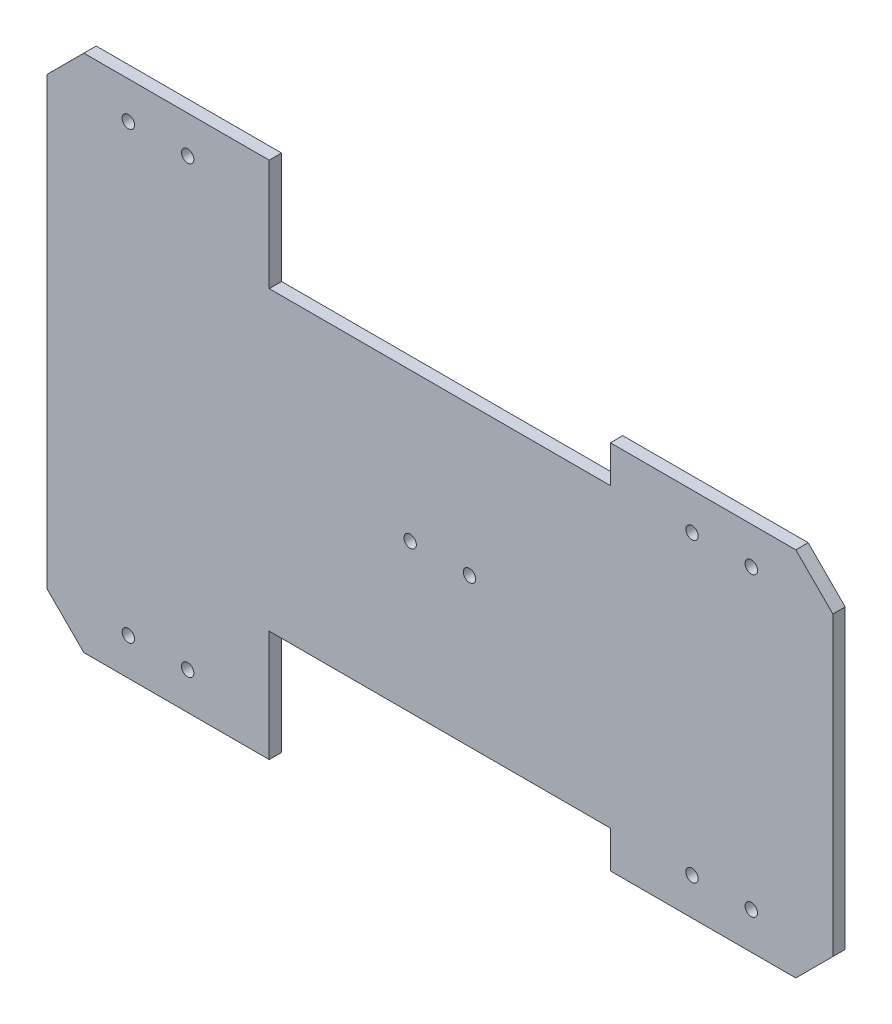
ISO-10303-21;
HEADER;
FILE_DESCRIPTION(('STEP AP214'),'2;1');
FILE_NAME('part.step','',(''),(''),'','','');
FILE_SCHEMA(('AUTOMOTIVE_DESIGN { 1 0 10303 214 1 1 1 1 }'));
ENDSEC;
DATA;
#1=APPLICATION_CONTEXT('core data for automotive mechanical design processes');
#2=APPLICATION_PROTOCOL_DEFINITION('international standard','automotive_design',2000,#1);
#3=PRODUCT_CONTEXT('',#1,'mechanical');
#4=PRODUCT('Part','Part','',(#3));
#5=PRODUCT_RELATED_PRODUCT_CATEGORY('part','',(#4));
#6=PRODUCT_DEFINITION_FORMATION('','',#4);
#7=PRODUCT_DEFINITION_CONTEXT('part definition',#1,'design');
#8=PRODUCT_DEFINITION('design','',#6,#7);
#9=PRODUCT_DEFINITION_SHAPE('','',#8);
#10=(LENGTH_UNIT() NAMED_UNIT(*) SI_UNIT(.MILLI.,.METRE.));
#11=(NAMED_UNIT(*) PLANE_ANGLE_UNIT() SI_UNIT($,.RADIAN.));
#12=(NAMED_UNIT(*) SI_UNIT($,.STERADIAN.) SOLID_ANGLE_UNIT());
#13=UNCERTAINTY_MEASURE_WITH_UNIT(LENGTH_MEASURE(1.E-05),#10,'distance_accuracy_value','');
#14=(GEOMETRIC_REPRESENTATION_CONTEXT(3) GLOBAL_UNCERTAINTY_ASSIGNED_CONTEXT((#13)) GLOBAL_UNIT_ASSIGNED_CONTEXT((#10,
#11,#12)) REPRESENTATION_CONTEXT('',''));
#15=CARTESIAN_POINT('',(0.,0.,0.));
#16=DIRECTION('',(0.,0.,1.));
#17=DIRECTION('',(1.,0.,0.));
#18=AXIS2_PLACEMENT_3D('',#15,#16,#17);
#19=CARTESIAN_POINT('',(-122.069969569105,-70.000000012,0.));
#20=DIRECTION('',(0.,-1.,0.));
#21=DIRECTION('',(0.,0.,-1.));
#22=AXIS2_PLACEMENT_3D('',#19,#20,#21);
#23=PLANE('',#22);
#24=DIRECTION('',(1.,0.,0.));
#25=VECTOR('',#24,1.);
#26=CARTESIAN_POINT('',(-122.069969569105,-70.000000012,5.));
#27=LINE('',#26,#25);
#28=CARTESIAN_POINT('',(-122.069969569105,-70.000000012,5.));
#29=VERTEX_POINT('',#28);
#30=CARTESIAN_POINT('',(15.9300304188953,-70.000000012,5.));
#31=VERTEX_POINT('',#30);
#32=EDGE_CURVE('E184',#29,#31,#27,.T.);
#33=ORIENTED_EDGE('',*,*,#32,.F.);
#34=DIRECTION('',(0.,0.,1.));
#35=VECTOR('',#34,1.);
#36=CARTESIAN_POINT('',(-122.069969569105,-70.000000012,0.));
#37=LINE('',#36,#35);
#38=CARTESIAN_POINT('',(-122.069969569105,-70.000000012,0.));
#39=VERTEX_POINT('',#38);
#40=EDGE_CURVE('E11',#39,#29,#37,.T.);
#41=ORIENTED_EDGE('',*,*,#40,.F.);
#42=DIRECTION('',(1.,0.,0.));
#43=VECTOR('',#42,1.);
#44=CARTESIAN_POINT('',(-122.069969569105,-70.000000012,0.));
#45=LINE('',#44,#43);
#46=CARTESIAN_POINT('',(15.9300304188953,-70.000000012,0.));
#47=VERTEX_POINT('',#46);
#48=EDGE_CURVE('E229',#39,#47,#45,.T.);
#49=ORIENTED_EDGE('',*,*,#48,.T.);
#50=DIRECTION('',(0.,0.,1.));
#51=VECTOR('',#50,1.);
#52=CARTESIAN_POINT('',(15.9300304188953,-70.000000012,0.));
#53=LINE('',#52,#51);
#54=EDGE_CURVE('E42',#47,#31,#53,.T.);
#55=ORIENTED_EDGE('',*,*,#54,.T.);
#56=EDGE_LOOP('',(#33,#41,#49,#55));
#57=FACE_BOUND('',#56,.T.);
#58=ADVANCED_FACE('F39',(#57),#23,.T.);
#59=CARTESIAN_POINT('',(-122.069969569105,-114.999999997,0.));
#60=DIRECTION('',(1.,0.,0.));
#61=DIRECTION('',(0.,0.,-1.));
#62=AXIS2_PLACEMENT_3D('',#59,#60,#61);
#63=PLANE('',#62);
#64=DIRECTION('',(0.,1.,0.));
#65=VECTOR('',#64,1.);
#66=CARTESIAN_POINT('',(-122.069969569105,-114.999999997,5.));
#67=LINE('',#66,#65);
#68=CARTESIAN_POINT('',(-122.069969569105,-114.999999997,5.));
#69=VERTEX_POINT('',#68);
#70=EDGE_CURVE('E227',#69,#29,#67,.T.);
#71=ORIENTED_EDGE('',*,*,#70,.F.);
#72=DIRECTION('',(0.,0.,1.));
#73=VECTOR('',#72,1.);
#74=CARTESIAN_POINT('',(-122.069969569105,-114.999999997,0.));
#75=LINE('',#74,#73);
#76=CARTESIAN_POINT('',(-122.069969569105,-114.999999997,0.));
#77=VERTEX_POINT('',#76);
#78=EDGE_CURVE('E48',#77,#69,#75,.T.);
#79=ORIENTED_EDGE('',*,*,#78,.F.);
#80=DIRECTION('',(0.,1.,0.));
#81=VECTOR('',#80,1.);
#82=CARTESIAN_POINT('',(-122.069969569105,-114.999999997,0.));
#83=LINE('',#82,#81);
#84=EDGE_CURVE('E174',#77,#39,#83,.T.);
#85=ORIENTED_EDGE('',*,*,#84,.T.);
#86=ORIENTED_EDGE('',*,*,#40,.T.);
#87=EDGE_LOOP('',(#71,#79,#85,#86));
#88=FACE_BOUND('',#87,.T.);
#89=ADVANCED_FACE('F257',(#88),#63,.T.);
#90=CARTESIAN_POINT('',(-197.069969626105,-114.999999997,0.));
#91=DIRECTION('',(0.,-1.,0.));
#92=DIRECTION('',(0.,0.,-1.));
#93=AXIS2_PLACEMENT_3D('',#90,#91,#92);
#94=PLANE('',#93);
#95=DIRECTION('',(1.,0.,0.));
#96=VECTOR('',#95,1.);
#97=CARTESIAN_POINT('',(-197.069969626105,-114.999999997,5.));
#98=LINE('',#97,#96);
#99=CARTESIAN_POINT('',(-197.069969626105,-114.999999997,5.));
#100=VERTEX_POINT('',#99);
#101=EDGE_CURVE('E161',#100,#69,#98,.T.);
#102=ORIENTED_EDGE('',*,*,#101,.F.);
#103=DIRECTION('',(0.,0.,1.));
#104=VECTOR('',#103,1.);
#105=CARTESIAN_POINT('',(-197.069969626105,-114.999999997,0.));
#106=LINE('',#105,#104);
#107=CARTESIAN_POINT('',(-197.069969626105,-114.999999997,0.));
#108=VERTEX_POINT('',#107);
#109=EDGE_CURVE('E156',#108,#100,#106,.T.);
#110=ORIENTED_EDGE('',*,*,#109,.F.);
#111=DIRECTION('',(1.,0.,0.));
#112=VECTOR('',#111,1.);
#113=CARTESIAN_POINT('',(-197.069969626105,-114.999999997,0.));
#114=LINE('',#113,#112);
#115=EDGE_CURVE('E159',#108,#77,#114,.T.);
#116=ORIENTED_EDGE('',*,*,#115,.T.);
#117=ORIENTED_EDGE('',*,*,#78,.T.);
#118=EDGE_LOOP('',(#102,#110,#116,#117));
#119=FACE_BOUND('',#118,.T.);
#120=ADVANCED_FACE('F158',(#119),#94,.T.);
#121=CARTESIAN_POINT('',(-212.069969578105,-100.000000045,0.));
#122=DIRECTION('',(-0.707106781186546,-0.707106781186549,0.));
#123=DIRECTION('',(0.707106781186549,-0.707106781186546,0.));
#124=AXIS2_PLACEMENT_3D('',#121,#122,#123);
#125=PLANE('',#124);
#126=DIRECTION('',(0.707106781186549,-0.707106781186546,0.));
#127=VECTOR('',#126,1.);
#128=CARTESIAN_POINT('',(-212.069969578105,-100.000000045,5.));
#129=LINE('',#128,#127);
#130=CARTESIAN_POINT('',(-212.069969578105,-100.000000045,5.));
#131=VERTEX_POINT('',#130);
#132=EDGE_CURVE('E224',#131,#100,#129,.T.);
#133=ORIENTED_EDGE('',*,*,#132,.F.);
#134=DIRECTION('',(0.,0.,1.));
#135=VECTOR('',#134,1.);
#136=CARTESIAN_POINT('',(-212.069969578105,-100.000000045,0.));
#137=LINE('',#136,#135);
#138=CARTESIAN_POINT('',(-212.069969578105,-100.000000045,0.));
#139=VERTEX_POINT('',#138);
#140=EDGE_CURVE('E166',#139,#131,#137,.T.);
#141=ORIENTED_EDGE('',*,*,#140,.F.);
#142=DIRECTION('',(0.707106781186549,-0.707106781186546,0.));
#143=VECTOR('',#142,1.);
#144=CARTESIAN_POINT('',(-212.069969578105,-100.000000045,0.));
#145=LINE('',#144,#143);
#146=EDGE_CURVE('E172',#139,#108,#145,.T.);
#147=ORIENTED_EDGE('',*,*,#146,.T.);
#148=ORIENTED_EDGE('',*,*,#109,.T.);
#149=EDGE_LOOP('',(#133,#141,#147,#148));
#150=FACE_BOUND('',#149,.T.);
#151=ADVANCED_FACE('F176',(#150),#125,.T.);
#152=CARTESIAN_POINT('',(-212.069969578105,80.000000045,0.));
#153=DIRECTION('',(-1.,0.,0.));
#154=DIRECTION('',(0.,-1.,0.));
#155=AXIS2_PLACEMENT_3D('',#152,#153,#154);
#156=PLANE('',#155);
#157=DIRECTION('',(0.,-1.,0.));
#158=VECTOR('',#157,1.);
#159=CARTESIAN_POINT('',(-212.069969578105,80.000000045,5.));
#160=LINE('',#159,#158);
#161=CARTESIAN_POINT('',(-212.069969578105,80.000000045,5.));
#162=VERTEX_POINT('',#161);
#163=EDGE_CURVE('E221',#162,#131,#160,.T.);
#164=ORIENTED_EDGE('',*,*,#163,.F.);
#165=DIRECTION('',(0.,0.,1.));
#166=VECTOR('',#165,1.);
#167=CARTESIAN_POINT('',(-212.069969578105,80.000000045,0.));
#168=LINE('',#167,#166);
#169=CARTESIAN_POINT('',(-212.069969578105,80.000000045,0.));
#170=VERTEX_POINT('',#169);
#171=EDGE_CURVE('E233',#170,#162,#168,.T.);
#172=ORIENTED_EDGE('',*,*,#171,.F.);
#173=DIRECTION('',(0.,-1.,0.));
#174=VECTOR('',#173,1.);
#175=CARTESIAN_POINT('',(-212.069969578105,80.000000045,0.));
#176=LINE('',#175,#174);
#177=EDGE_CURVE('E177',#170,#139,#176,.T.);
#178=ORIENTED_EDGE('',*,*,#177,.T.);
#179=ORIENTED_EDGE('',*,*,#140,.T.);
#180=EDGE_LOOP('',(#164,#172,#178,#179));
#181=FACE_BOUND('',#180,.T.);
#182=ADVANCED_FACE('F270',(#181),#156,.T.);
#183=CARTESIAN_POINT('',(-197.069969626105,94.9999999969999,0.));
#184=DIRECTION('',(-0.707106781186548,0.707106781186547,0.));
#185=DIRECTION('',(-0.707106781186547,-0.707106781186548,0.));
#186=AXIS2_PLACEMENT_3D('',#183,#184,#185);
#187=PLANE('',#186);
#188=DIRECTION('',(-0.707106781186547,-0.707106781186548,0.));
#189=VECTOR('',#188,1.);
#190=CARTESIAN_POINT('',(-197.069969626105,94.9999999969999,5.));
#191=LINE('',#190,#189);
#192=CARTESIAN_POINT('',(-197.069969626105,94.9999999969999,5.));
#193=VERTEX_POINT('',#192);
#194=EDGE_CURVE('E218',#193,#162,#191,.T.);
#195=ORIENTED_EDGE('',*,*,#194,.F.);
#196=DIRECTION('',(0.,0.,1.));
#197=VECTOR('',#196,1.);
#198=CARTESIAN_POINT('',(-197.069969626105,94.9999999969999,0.));
#199=LINE('',#198,#197);
#200=CARTESIAN_POINT('',(-197.069969626105,94.9999999969999,0.));
#201=VERTEX_POINT('',#200);
#202=EDGE_CURVE('E235',#201,#193,#199,.T.);
#203=ORIENTED_EDGE('',*,*,#202,.F.);
#204=DIRECTION('',(-0.707106781186547,-0.707106781186548,0.));
#205=VECTOR('',#204,1.);
#206=CARTESIAN_POINT('',(-197.069969626105,94.9999999969999,0.));
#207=LINE('',#206,#205);
#208=EDGE_CURVE('E179',#201,#170,#207,.T.);
#209=ORIENTED_EDGE('',*,*,#208,.T.);
#210=ORIENTED_EDGE('',*,*,#171,.T.);
#211=EDGE_LOOP('',(#195,#203,#209,#210));
#212=FACE_BOUND('',#211,.T.);
#213=ADVANCED_FACE('F273',(#212),#187,.T.);
#214=CARTESIAN_POINT('',(-122.069969569105,94.999999997,0.));
#215=DIRECTION('',(0.,1.,0.));
#216=DIRECTION('',(-1.,0.,0.));
#217=AXIS2_PLACEMENT_3D('',#214,#215,#216);
#218=PLANE('',#217);
#219=DIRECTION('',(-1.,0.,0.));
#220=VECTOR('',#219,1.);
#221=CARTESIAN_POINT('',(-122.069969569105,94.999999997,5.));
#222=LINE('',#221,#220);
#223=CARTESIAN_POINT('',(-122.069969569105,94.999999997,5.));
#224=VERTEX_POINT('',#223);
#225=EDGE_CURVE('E215',#224,#193,#222,.T.);
#226=ORIENTED_EDGE('',*,*,#225,.F.);
#227=DIRECTION('',(0.,0.,1.));
#228=VECTOR('',#227,1.);
#229=CARTESIAN_POINT('',(-122.069969569105,94.999999997,0.));
#230=LINE('',#229,#228);
#231=CARTESIAN_POINT('',(-122.069969569105,94.999999997,0.));
#232=VERTEX_POINT('',#231);
#233=EDGE_CURVE('E237',#232,#224,#230,.T.);
#234=ORIENTED_EDGE('',*,*,#233,.F.);
#235=DIRECTION('',(-1.,0.,0.));
#236=VECTOR('',#235,1.);
#237=CARTESIAN_POINT('',(-122.069969569105,94.999999997,0.));
#238=LINE('',#237,#236);
#239=EDGE_CURVE('E455',#232,#201,#238,.T.);
#240=ORIENTED_EDGE('',*,*,#239,.T.);
#241=ORIENTED_EDGE('',*,*,#202,.T.);
#242=EDGE_LOOP('',(#226,#234,#240,#241));
#243=FACE_BOUND('',#242,.T.);
#244=ADVANCED_FACE('F277',(#243),#218,.T.);
#245=CARTESIAN_POINT('',(-122.069969569105,50.000000018,0.));
#246=DIRECTION('',(1.,0.,0.));
#247=DIRECTION('',(0.,0.,-1.));
#248=AXIS2_PLACEMENT_3D('',#245,#246,#247);
#249=PLANE('',#248);
#250=DIRECTION('',(0.,1.,0.));
#251=VECTOR('',#250,1.);
#252=CARTESIAN_POINT('',(-122.069969569105,50.000000018,5.));
#253=LINE('',#252,#251);
#254=CARTESIAN_POINT('',(-122.069969569105,50.000000018,5.));
#255=VERTEX_POINT('',#254);
#256=EDGE_CURVE('E212',#255,#224,#253,.T.);
#257=ORIENTED_EDGE('',*,*,#256,.F.);
#258=DIRECTION('',(0.,0.,1.));
#259=VECTOR('',#258,1.);
#260=CARTESIAN_POINT('',(-122.069969569105,50.000000018,0.));
#261=LINE('',#260,#259);
#262=CARTESIAN_POINT('',(-122.069969569105,50.000000018,0.));
#263=VERTEX_POINT('',#262);
#264=EDGE_CURVE('E239',#263,#255,#261,.T.);
#265=ORIENTED_EDGE('',*,*,#264,.F.);
#266=DIRECTION('',(0.,1.,0.));
#267=VECTOR('',#266,1.);
#268=CARTESIAN_POINT('',(-122.069969569105,50.000000018,0.));
#269=LINE('',#268,#267);
#270=EDGE_CURVE('E452',#263,#232,#269,.T.);
#271=ORIENTED_EDGE('',*,*,#270,.T.);
#272=ORIENTED_EDGE('',*,*,#233,.T.);
#273=EDGE_LOOP('',(#257,#265,#271,#272));
#274=FACE_BOUND('',#273,.T.);
#275=ADVANCED_FACE('F281',(#274),#249,.T.);
#276=CARTESIAN_POINT('',(15.9300304188953,50.000000018,0.));
#277=DIRECTION('',(0.,1.,0.));
#278=DIRECTION('',(-1.,0.,0.));
#279=AXIS2_PLACEMENT_3D('',#276,#277,#278);
#280=PLANE('',#279);
#281=DIRECTION('',(-1.,0.,0.));
#282=VECTOR('',#281,1.);
#283=CARTESIAN_POINT('',(15.9300304188953,50.000000018,5.));
#284=LINE('',#283,#282);
#285=CARTESIAN_POINT('',(15.9300304188953,50.000000018,5.));
#286=VERTEX_POINT('',#285);
#287=EDGE_CURVE('E209',#286,#255,#284,.T.);
#288=ORIENTED_EDGE('',*,*,#287,.F.);
#289=DIRECTION('',(0.,0.,1.));
#290=VECTOR('',#289,1.);
#291=CARTESIAN_POINT('',(15.9300304188953,50.000000018,0.));
#292=LINE('',#291,#290);
#293=CARTESIAN_POINT('',(15.9300304188953,50.000000018,0.));
#294=VERTEX_POINT('',#293);
#295=EDGE_CURVE('E241',#294,#286,#292,.T.);
#296=ORIENTED_EDGE('',*,*,#295,.F.);
#297=DIRECTION('',(-1.,0.,0.));
#298=VECTOR('',#297,1.);
#299=CARTESIAN_POINT('',(15.9300304188953,50.000000018,0.));
#300=LINE('',#299,#298);
#301=EDGE_CURVE('E449',#294,#263,#300,.T.);
#302=ORIENTED_EDGE('',*,*,#301,.T.);
#303=ORIENTED_EDGE('',*,*,#264,.T.);
#304=EDGE_LOOP('',(#288,#296,#302,#303));
#305=FACE_BOUND('',#304,.T.);
#306=ADVANCED_FACE('F285',(#305),#280,.T.);
#307=CARTESIAN_POINT('',(15.9300304188953,64.999999967,0.));
#308=DIRECTION('',(-1.,0.,0.));
#309=DIRECTION('',(0.,0.,1.));
#310=AXIS2_PLACEMENT_3D('',#307,#308,#309);
#311=PLANE('',#310);
#312=DIRECTION('',(0.,-1.,0.));
#313=VECTOR('',#312,1.);
#314=CARTESIAN_POINT('',(15.9300304188953,64.999999967,5.));
#315=LINE('',#314,#313);
#316=CARTESIAN_POINT('',(15.9300304188953,64.999999967,5.));
#317=VERTEX_POINT('',#316);
#318=EDGE_CURVE('E206',#317,#286,#315,.T.);
#319=ORIENTED_EDGE('',*,*,#318,.F.);
#320=DIRECTION('',(0.,0.,1.));
#321=VECTOR('',#320,1.);
#322=CARTESIAN_POINT('',(15.9300304188953,64.999999967,0.));
#323=LINE('',#322,#321);
#324=CARTESIAN_POINT('',(15.9300304188953,64.999999967,0.));
#325=VERTEX_POINT('',#324);
#326=EDGE_CURVE('E243',#325,#317,#323,.T.);
#327=ORIENTED_EDGE('',*,*,#326,.F.);
#328=DIRECTION('',(0.,-1.,0.));
#329=VECTOR('',#328,1.);
#330=CARTESIAN_POINT('',(15.9300304188953,64.999999967,0.));
#331=LINE('',#330,#329);
#332=EDGE_CURVE('E446',#325,#294,#331,.T.);
#333=ORIENTED_EDGE('',*,*,#332,.T.);
#334=ORIENTED_EDGE('',*,*,#295,.T.);
#335=EDGE_LOOP('',(#319,#327,#333,#334));
#336=FACE_BOUND('',#335,.T.);
#337=ADVANCED_FACE('F289',(#336),#311,.T.);
#338=CARTESIAN_POINT('',(90.9300304758953,64.999999967,0.));
#339=DIRECTION('',(0.,1.,0.));
#340=DIRECTION('',(0.,0.,1.));
#341=AXIS2_PLACEMENT_3D('',#338,#339,#340);
#342=PLANE('',#341);
#343=DIRECTION('',(-1.,0.,0.));
#344=VECTOR('',#343,1.);
#345=CARTESIAN_POINT('',(90.9300304758953,64.999999967,5.));
#346=LINE('',#345,#344);
#347=CARTESIAN_POINT('',(90.9300304758953,64.999999967,5.));
#348=VERTEX_POINT('',#347);
#349=EDGE_CURVE('E203',#348,#317,#346,.T.);
#350=ORIENTED_EDGE('',*,*,#349,.F.);
#351=DIRECTION('',(0.,0.,1.));
#352=VECTOR('',#351,1.);
#353=CARTESIAN_POINT('',(90.9300304758953,64.999999967,0.));
#354=LINE('',#353,#352);
#355=CARTESIAN_POINT('',(90.9300304758953,64.999999967,0.));
#356=VERTEX_POINT('',#355);
#357=EDGE_CURVE('E245',#356,#348,#354,.T.);
#358=ORIENTED_EDGE('',*,*,#357,.F.);
#359=DIRECTION('',(-1.,0.,0.));
#360=VECTOR('',#359,1.);
#361=CARTESIAN_POINT('',(90.9300304758953,64.999999967,0.));
#362=LINE('',#361,#360);
#363=EDGE_CURVE('E443',#356,#325,#362,.T.);
#364=ORIENTED_EDGE('',*,*,#363,.T.);
#365=ORIENTED_EDGE('',*,*,#326,.T.);
#366=EDGE_LOOP('',(#350,#358,#364,#365));
#367=FACE_BOUND('',#366,.T.);
#368=ADVANCED_FACE('F293',(#367),#342,.T.);
#369=CARTESIAN_POINT('',(105.930030424145,50.00000001875,0.));
#370=DIRECTION('',(0.707106781186548,0.707106781186547,0.));
#371=DIRECTION('',(-0.707106781186547,0.707106781186548,0.));
#372=AXIS2_PLACEMENT_3D('',#369,#370,#371);
#373=PLANE('',#372);
#374=DIRECTION('',(-0.707106781186547,0.707106781186548,0.));
#375=VECTOR('',#374,1.);
#376=CARTESIAN_POINT('',(105.930030424145,50.00000001875,5.));
#377=LINE('',#376,#375);
#378=CARTESIAN_POINT('',(105.930030424145,50.00000001875,5.));
#379=VERTEX_POINT('',#378);
#380=EDGE_CURVE('E200',#379,#348,#377,.T.);
#381=ORIENTED_EDGE('',*,*,#380,.F.);
#382=DIRECTION('',(0.,0.,1.));
#383=VECTOR('',#382,1.);
#384=CARTESIAN_POINT('',(105.930030424145,50.00000001875,0.));
#385=LINE('',#384,#383);
#386=CARTESIAN_POINT('',(105.930030424145,50.00000001875,0.));
#387=VERTEX_POINT('',#386);
#388=EDGE_CURVE('E247',#387,#379,#385,.T.);
#389=ORIENTED_EDGE('',*,*,#388,.F.);
#390=DIRECTION('',(-0.707106781186547,0.707106781186548,0.));
#391=VECTOR('',#390,1.);
#392=CARTESIAN_POINT('',(105.930030424145,50.00000001875,0.));
#393=LINE('',#392,#391);
#394=EDGE_CURVE('E440',#387,#356,#393,.T.);
#395=ORIENTED_EDGE('',*,*,#394,.T.);
#396=ORIENTED_EDGE('',*,*,#357,.T.);
#397=EDGE_LOOP('',(#381,#389,#395,#396));
#398=FACE_BOUND('',#397,.T.);
#399=ADVANCED_FACE('F297',(#398),#373,.T.);
#400=CARTESIAN_POINT('',(105.930030424145,-70.00000004125,0.));
#401=DIRECTION('',(1.,0.,0.));
#402=DIRECTION('',(0.,1.,0.));
#403=AXIS2_PLACEMENT_3D('',#400,#401,#402);
#404=PLANE('',#403);
#405=DIRECTION('',(0.,1.,0.));
#406=VECTOR('',#405,1.);
#407=CARTESIAN_POINT('',(105.930030424145,-70.00000004125,5.));
#408=LINE('',#407,#406);
#409=CARTESIAN_POINT('',(105.930030424145,-70.00000004125,5.));
#410=VERTEX_POINT('',#409);
#411=EDGE_CURVE('E197',#410,#379,#408,.T.);
#412=ORIENTED_EDGE('',*,*,#411,.F.);
#413=DIRECTION('',(0.,0.,1.));
#414=VECTOR('',#413,1.);
#415=CARTESIAN_POINT('',(105.930030424145,-70.00000004125,0.));
#416=LINE('',#415,#414);
#417=CARTESIAN_POINT('',(105.930030424145,-70.00000004125,0.));
#418=VERTEX_POINT('',#417);
#419=EDGE_CURVE('E249',#418,#410,#416,.T.);
#420=ORIENTED_EDGE('',*,*,#419,.F.);
#421=DIRECTION('',(0.,1.,0.));
#422=VECTOR('',#421,1.);
#423=CARTESIAN_POINT('',(105.930030424145,-70.00000004125,0.));
#424=LINE('',#423,#422);
#425=EDGE_CURVE('E437',#418,#387,#424,.T.);
#426=ORIENTED_EDGE('',*,*,#425,.T.);
#427=ORIENTED_EDGE('',*,*,#388,.T.);
#428=EDGE_LOOP('',(#412,#420,#426,#427));
#429=FACE_BOUND('',#428,.T.);
#430=ADVANCED_FACE('F301',(#429),#404,.T.);
#431=CARTESIAN_POINT('',(90.9300304758953,-84.9999999895,0.));
#432=DIRECTION('',(0.707106781186548,-0.707106781186547,0.));
#433=DIRECTION('',(0.707106781186547,0.707106781186548,0.));
#434=AXIS2_PLACEMENT_3D('',#431,#432,#433);
#435=PLANE('',#434);
#436=DIRECTION('',(0.707106781186547,0.707106781186548,0.));
#437=VECTOR('',#436,1.);
#438=CARTESIAN_POINT('',(90.9300304758953,-84.9999999895,5.));
#439=LINE('',#438,#437);
#440=CARTESIAN_POINT('',(90.9300304758953,-84.9999999895,5.));
#441=VERTEX_POINT('',#440);
#442=EDGE_CURVE('E194',#441,#410,#439,.T.);
#443=ORIENTED_EDGE('',*,*,#442,.F.);
#444=DIRECTION('',(0.,0.,1.));
#445=VECTOR('',#444,1.);
#446=CARTESIAN_POINT('',(90.9300304758953,-84.9999999895,0.));
#447=LINE('',#446,#445);
#448=CARTESIAN_POINT('',(90.9300304758953,-84.9999999895,0.));
#449=VERTEX_POINT('',#448);
#450=EDGE_CURVE('E251',#449,#441,#447,.T.);
#451=ORIENTED_EDGE('',*,*,#450,.F.);
#452=DIRECTION('',(0.707106781186547,0.707106781186548,0.));
#453=VECTOR('',#452,1.);
#454=CARTESIAN_POINT('',(90.9300304758953,-84.9999999895,0.));
#455=LINE('',#454,#453);
#456=EDGE_CURVE('E434',#449,#418,#455,.T.);
#457=ORIENTED_EDGE('',*,*,#456,.T.);
#458=ORIENTED_EDGE('',*,*,#419,.T.);
#459=EDGE_LOOP('',(#443,#451,#457,#458));
#460=FACE_BOUND('',#459,.T.);
#461=ADVANCED_FACE('F305',(#460),#435,.T.);
#462=CARTESIAN_POINT('',(15.9300304188953,-84.9999999895,0.));
#463=DIRECTION('',(0.,-1.,0.));
#464=DIRECTION('',(0.,0.,-1.));
#465=AXIS2_PLACEMENT_3D('',#462,#463,#464);
#466=PLANE('',#465);
#467=DIRECTION('',(1.,0.,0.));
#468=VECTOR('',#467,1.);
#469=CARTESIAN_POINT('',(15.9300304188953,-84.9999999895,5.));
#470=LINE('',#469,#468);
#471=CARTESIAN_POINT('',(15.9300304188953,-84.9999999895,5.));
#472=VERTEX_POINT('',#471);
#473=EDGE_CURVE('E191',#472,#441,#470,.T.);
#474=ORIENTED_EDGE('',*,*,#473,.F.);
#475=DIRECTION('',(0.,0.,1.));
#476=VECTOR('',#475,1.);
#477=CARTESIAN_POINT('',(15.9300304188953,-84.9999999895,0.));
#478=LINE('',#477,#476);
#479=CARTESIAN_POINT('',(15.9300304188953,-84.9999999895,0.));
#480=VERTEX_POINT('',#479);
#481=EDGE_CURVE('E252',#480,#472,#478,.T.);
#482=ORIENTED_EDGE('',*,*,#481,.F.);
#483=DIRECTION('',(1.,0.,0.));
#484=VECTOR('',#483,1.);
#485=CARTESIAN_POINT('',(15.9300304188953,-84.9999999895,0.));
#486=LINE('',#485,#484);
#487=EDGE_CURVE('E431',#480,#449,#486,.T.);
#488=ORIENTED_EDGE('',*,*,#487,.T.);
#489=ORIENTED_EDGE('',*,*,#450,.T.);
#490=EDGE_LOOP('',(#474,#482,#488,#489));
#491=FACE_BOUND('',#490,.T.);
#492=ADVANCED_FACE('F309',(#491),#466,.T.);
#493=CARTESIAN_POINT('',(15.9300304188953,-70.000000012,0.));
#494=DIRECTION('',(-1.,0.,0.));
#495=DIRECTION('',(0.,0.,1.));
#496=AXIS2_PLACEMENT_3D('',#493,#494,#495);
#497=PLANE('',#496);
#498=DIRECTION('',(0.,-1.,0.));
#499=VECTOR('',#498,1.);
#500=CARTESIAN_POINT('',(15.9300304188953,-70.000000012,5.));
#501=LINE('',#500,#499);
#502=EDGE_CURVE('E187',#31,#472,#501,.T.);
#503=ORIENTED_EDGE('',*,*,#502,.F.);
#504=ORIENTED_EDGE('',*,*,#54,.F.);
#505=DIRECTION('',(0.,-1.,0.));
#506=VECTOR('',#505,1.);
#507=CARTESIAN_POINT('',(15.9300304188953,-70.000000012,0.));
#508=LINE('',#507,#506);
#509=EDGE_CURVE('E429',#47,#480,#508,.T.);
#510=ORIENTED_EDGE('',*,*,#509,.T.);
#511=ORIENTED_EDGE('',*,*,#481,.T.);
#512=EDGE_LOOP('',(#503,#504,#510,#511));
#513=FACE_BOUND('',#512,.T.);
#514=ADVANCED_FACE('F254',(#513),#497,.T.);
#515=CARTESIAN_POINT('',(0.,0.,0.));
#516=DIRECTION('',(0.,0.,-1.));
#517=DIRECTION('',(-1.,0.,0.));
#518=AXIS2_PLACEMENT_3D('',#515,#516,#517);
#519=PLANE('',#518);
#520=CARTESIAN_POINT('',(48.9300304215203,-70.0000000225,0.));
#521=DIRECTION('',(0.,0.,1.));
#522=DIRECTION('',(1.,0.,0.));
#523=AXIS2_PLACEMENT_3D('',#520,#521,#522);
#524=CIRCLE('',#523,2.5);
#525=CARTESIAN_POINT('',(51.4300304215203,-70.0000000225,0.));
#526=VERTEX_POINT('',#525);
#527=EDGE_CURVE('E368',#526,#526,#524,.T.);
#528=ORIENTED_EDGE('',*,*,#527,.T.);
#529=EDGE_LOOP('',(#528));
#530=FACE_BOUND('',#529,.T.);
#531=CARTESIAN_POINT('',(-155.069969573605,-100.,0.));
#532=DIRECTION('',(0.,0.,1.));
#533=DIRECTION('',(1.,0.,0.));
#534=AXIS2_PLACEMENT_3D('',#531,#532,#533);
#535=CIRCLE('',#534,2.50000000000002);
#536=CARTESIAN_POINT('',(-152.569969573605,-100.,0.));
#537=VERTEX_POINT('',#536);
#538=EDGE_CURVE('E376',#537,#537,#535,.T.);
#539=ORIENTED_EDGE('',*,*,#538,.T.);
#540=EDGE_LOOP('',(#539));
#541=FACE_BOUND('',#540,.T.);
#542=CARTESIAN_POINT('',(72.9300304215203,50.,0.));
#543=DIRECTION('',(0.,0.,1.));
#544=DIRECTION('',(1.,0.,0.));
#545=AXIS2_PLACEMENT_3D('',#542,#543,#544);
#546=CIRCLE('',#545,2.50000000000001);
#547=CARTESIAN_POINT('',(75.4300304215203,50.,0.));
#548=VERTEX_POINT('',#547);
#549=EDGE_CURVE('E382',#548,#548,#546,.T.);
#550=ORIENTED_EDGE('',*,*,#549,.T.);
#551=EDGE_LOOP('',(#550));
#552=FACE_BOUND('',#551,.T.);
#553=CARTESIAN_POINT('',(-179.069969573605,80.,0.));
#554=DIRECTION('',(0.,0.,1.));
#555=DIRECTION('',(1.,0.,0.));
#556=AXIS2_PLACEMENT_3D('',#553,#554,#555);
#557=CIRCLE('',#556,2.5);
#558=CARTESIAN_POINT('',(-176.569969573605,80.,0.));
#559=VERTEX_POINT('',#558);
#560=EDGE_CURVE('E388',#559,#559,#557,.T.);
#561=ORIENTED_EDGE('',*,*,#560,.T.);
#562=EDGE_LOOP('',(#561));
#563=FACE_BOUND('',#562,.T.);
#564=CARTESIAN_POINT('',(-41.0699695751047,-10.00000001125,0.));
#565=DIRECTION('',(0.,0.,1.));
#566=DIRECTION('',(-1.,0.,0.));
#567=AXIS2_PLACEMENT_3D('',#564,#565,#566);
#568=CIRCLE('',#567,2.5);
#569=CARTESIAN_POINT('',(-43.5699695751047,-10.00000001125,0.));
#570=VERTEX_POINT('',#569);
#571=EDGE_CURVE('E394',#570,#570,#568,.T.);
#572=ORIENTED_EDGE('',*,*,#571,.T.);
#573=EDGE_LOOP('',(#572));
#574=FACE_BOUND('',#573,.T.);
#575=CARTESIAN_POINT('',(-65.0699695751047,-10.,0.));
#576=DIRECTION('',(0.,0.,1.));
#577=DIRECTION('',(-1.,0.,0.));
#578=AXIS2_PLACEMENT_3D('',#575,#576,#577);
#579=CIRCLE('',#578,2.49999999999999);
#580=CARTESIAN_POINT('',(-67.5699695751047,-10.,0.));
#581=VERTEX_POINT('',#580);
#582=EDGE_CURVE('E400',#581,#581,#579,.T.);
#583=ORIENTED_EDGE('',*,*,#582,.T.);
#584=EDGE_LOOP('',(#583));
#585=FACE_BOUND('',#584,.T.);
#586=CARTESIAN_POINT('',(-179.069969573605,-99.9999999999999,0.));
#587=DIRECTION('',(0.,0.,1.));
#588=DIRECTION('',(-1.,0.,0.));
#589=AXIS2_PLACEMENT_3D('',#586,#587,#588);
#590=CIRCLE('',#589,2.49999999999997);
#591=CARTESIAN_POINT('',(-181.569969573605,-99.9999999999999,0.));
#592=VERTEX_POINT('',#591);
#593=EDGE_CURVE('E406',#592,#592,#590,.T.);
#594=ORIENTED_EDGE('',*,*,#593,.T.);
#595=EDGE_LOOP('',(#594));
#596=FACE_BOUND('',#595,.T.);
#597=CARTESIAN_POINT('',(-155.069969573605,80.,0.));
#598=DIRECTION('',(0.,0.,1.));
#599=DIRECTION('',(-1.,0.,0.));
#600=AXIS2_PLACEMENT_3D('',#597,#598,#599);
#601=CIRCLE('',#600,2.5);
#602=CARTESIAN_POINT('',(-157.569969573605,80.,0.));
#603=VERTEX_POINT('',#602);
#604=EDGE_CURVE('E412',#603,#603,#601,.T.);
#605=ORIENTED_EDGE('',*,*,#604,.T.);
#606=EDGE_LOOP('',(#605));
#607=FACE_BOUND('',#606,.T.);
#608=CARTESIAN_POINT('',(48.9300304215203,50.,0.));
#609=DIRECTION('',(0.,0.,1.));
#610=DIRECTION('',(-1.,0.,0.));
#611=AXIS2_PLACEMENT_3D('',#608,#609,#610);
#612=CIRCLE('',#611,2.5);
#613=CARTESIAN_POINT('',(46.4300304215203,50.,0.));
#614=VERTEX_POINT('',#613);
#615=EDGE_CURVE('E418',#614,#614,#612,.T.);
#616=ORIENTED_EDGE('',*,*,#615,.T.);
#617=EDGE_LOOP('',(#616));
#618=FACE_BOUND('',#617,.T.);
#619=CARTESIAN_POINT('',(72.9300304215203,-70.0000000224999,0.));
#620=DIRECTION('',(0.,0.,1.));
#621=DIRECTION('',(-1.,0.,0.));
#622=AXIS2_PLACEMENT_3D('',#619,#620,#621);
#623=CIRCLE('',#622,2.50000000000001);
#624=CARTESIAN_POINT('',(70.4300304215203,-70.0000000224999,0.));
#625=VERTEX_POINT('',#624);
#626=EDGE_CURVE('E188',#625,#625,#623,.T.);
#627=ORIENTED_EDGE('',*,*,#626,.T.);
#628=EDGE_LOOP('',(#627));
#629=FACE_BOUND('',#628,.T.);
#630=ORIENTED_EDGE('',*,*,#48,.F.);
#631=ORIENTED_EDGE('',*,*,#84,.F.);
#632=ORIENTED_EDGE('',*,*,#115,.F.);
#633=ORIENTED_EDGE('',*,*,#146,.F.);
#634=ORIENTED_EDGE('',*,*,#177,.F.);
#635=ORIENTED_EDGE('',*,*,#208,.F.);
#636=ORIENTED_EDGE('',*,*,#239,.F.);
#637=ORIENTED_EDGE('',*,*,#270,.F.);
#638=ORIENTED_EDGE('',*,*,#301,.F.);
#639=ORIENTED_EDGE('',*,*,#332,.F.);
#640=ORIENTED_EDGE('',*,*,#363,.F.);
#641=ORIENTED_EDGE('',*,*,#394,.F.);
#642=ORIENTED_EDGE('',*,*,#425,.F.);
#643=ORIENTED_EDGE('',*,*,#456,.F.);
#644=ORIENTED_EDGE('',*,*,#487,.F.);
#645=ORIENTED_EDGE('',*,*,#509,.F.);
#646=EDGE_LOOP('',(#630,#631,#632,#633,#634,#635,#636,#637,#638,#639,#640,#641,#642,#643,#644,#645));
#647=FACE_BOUND('',#646,.T.);
#648=ADVANCED_FACE('F170',(#530,#541,#552,#563,#574,#585,#596,#607,#618,#629,#647),#519,.T.);
#649=CARTESIAN_POINT('',(0.,0.,5.));
#650=DIRECTION('',(0.,0.,-1.));
#651=DIRECTION('',(-1.,0.,0.));
#652=AXIS2_PLACEMENT_3D('',#649,#650,#651);
#653=PLANE('',#652);
#654=CARTESIAN_POINT('',(48.9300304215203,-70.0000000225,5.));
#655=DIRECTION('',(0.,0.,1.));
#656=DIRECTION('',(1.,0.,0.));
#657=AXIS2_PLACEMENT_3D('',#654,#655,#656);
#658=CIRCLE('',#657,2.5);
#659=CARTESIAN_POINT('',(51.4300304215203,-70.0000000225,5.));
#660=VERTEX_POINT('',#659);
#661=EDGE_CURVE('E371',#660,#660,#658,.T.);
#662=ORIENTED_EDGE('',*,*,#661,.F.);
#663=EDGE_LOOP('',(#662));
#664=FACE_BOUND('',#663,.T.);
#665=CARTESIAN_POINT('',(-155.069969573605,-100.,5.));
#666=DIRECTION('',(0.,0.,1.));
#667=DIRECTION('',(1.,0.,0.));
#668=AXIS2_PLACEMENT_3D('',#665,#666,#667);
#669=CIRCLE('',#668,2.50000000000002);
#670=CARTESIAN_POINT('',(-152.569969573605,-100.,5.));
#671=VERTEX_POINT('',#670);
#672=EDGE_CURVE('E373',#671,#671,#669,.T.);
#673=ORIENTED_EDGE('',*,*,#672,.F.);
#674=EDGE_LOOP('',(#673));
#675=FACE_BOUND('',#674,.T.);
#676=CARTESIAN_POINT('',(72.9300304215203,50.,5.));
#677=DIRECTION('',(0.,0.,1.));
#678=DIRECTION('',(1.,0.,0.));
#679=AXIS2_PLACEMENT_3D('',#676,#677,#678);
#680=CIRCLE('',#679,2.50000000000001);
#681=CARTESIAN_POINT('',(75.4300304215203,50.,5.));
#682=VERTEX_POINT('',#681);
#683=EDGE_CURVE('E379',#682,#682,#680,.T.);
#684=ORIENTED_EDGE('',*,*,#683,.F.);
#685=EDGE_LOOP('',(#684));
#686=FACE_BOUND('',#685,.T.);
#687=CARTESIAN_POINT('',(-179.069969573605,80.,5.));
#688=DIRECTION('',(0.,0.,1.));
#689=DIRECTION('',(1.,0.,0.));
#690=AXIS2_PLACEMENT_3D('',#687,#688,#689);
#691=CIRCLE('',#690,2.5);
#692=CARTESIAN_POINT('',(-176.569969573605,80.,5.));
#693=VERTEX_POINT('',#692);
#694=EDGE_CURVE('E385',#693,#693,#691,.T.);
#695=ORIENTED_EDGE('',*,*,#694,.F.);
#696=EDGE_LOOP('',(#695));
#697=FACE_BOUND('',#696,.T.);
#698=CARTESIAN_POINT('',(-41.0699695751047,-10.00000001125,5.));
#699=DIRECTION('',(0.,0.,1.));
#700=DIRECTION('',(-1.,0.,0.));
#701=AXIS2_PLACEMENT_3D('',#698,#699,#700);
#702=CIRCLE('',#701,2.5);
#703=CARTESIAN_POINT('',(-43.5699695751047,-10.00000001125,5.));
#704=VERTEX_POINT('',#703);
#705=EDGE_CURVE('E391',#704,#704,#702,.T.);
#706=ORIENTED_EDGE('',*,*,#705,.F.);
#707=EDGE_LOOP('',(#706));
#708=FACE_BOUND('',#707,.T.);
#709=CARTESIAN_POINT('',(-65.0699695751047,-10.,5.));
#710=DIRECTION('',(0.,0.,1.));
#711=DIRECTION('',(-1.,0.,0.));
#712=AXIS2_PLACEMENT_3D('',#709,#710,#711);
#713=CIRCLE('',#712,2.49999999999999);
#714=CARTESIAN_POINT('',(-67.5699695751047,-10.,5.));
#715=VERTEX_POINT('',#714);
#716=EDGE_CURVE('E397',#715,#715,#713,.T.);
#717=ORIENTED_EDGE('',*,*,#716,.F.);
#718=EDGE_LOOP('',(#717));
#719=FACE_BOUND('',#718,.T.);
#720=CARTESIAN_POINT('',(-179.069969573605,-99.9999999999999,5.));
#721=DIRECTION('',(0.,0.,1.));
#722=DIRECTION('',(-1.,0.,0.));
#723=AXIS2_PLACEMENT_3D('',#720,#721,#722);
#724=CIRCLE('',#723,2.49999999999997);
#725=CARTESIAN_POINT('',(-181.569969573605,-99.9999999999999,5.));
#726=VERTEX_POINT('',#725);
#727=EDGE_CURVE('E403',#726,#726,#724,.T.);
#728=ORIENTED_EDGE('',*,*,#727,.F.);
#729=EDGE_LOOP('',(#728));
#730=FACE_BOUND('',#729,.T.);
#731=CARTESIAN_POINT('',(-155.069969573605,80.,5.));
#732=DIRECTION('',(0.,0.,1.));
#733=DIRECTION('',(-1.,0.,0.));
#734=AXIS2_PLACEMENT_3D('',#731,#732,#733);
#735=CIRCLE('',#734,2.5);
#736=CARTESIAN_POINT('',(-157.569969573605,80.,5.));
#737=VERTEX_POINT('',#736);
#738=EDGE_CURVE('E409',#737,#737,#735,.T.);
#739=ORIENTED_EDGE('',*,*,#738,.F.);
#740=EDGE_LOOP('',(#739));
#741=FACE_BOUND('',#740,.T.);
#742=CARTESIAN_POINT('',(48.9300304215203,50.,5.));
#743=DIRECTION('',(0.,0.,1.));
#744=DIRECTION('',(-1.,0.,0.));
#745=AXIS2_PLACEMENT_3D('',#742,#743,#744);
#746=CIRCLE('',#745,2.5);
#747=CARTESIAN_POINT('',(46.4300304215203,50.,5.));
#748=VERTEX_POINT('',#747);
#749=EDGE_CURVE('E415',#748,#748,#746,.T.);
#750=ORIENTED_EDGE('',*,*,#749,.F.);
#751=EDGE_LOOP('',(#750));
#752=FACE_BOUND('',#751,.T.);
#753=CARTESIAN_POINT('',(72.9300304215203,-70.0000000224999,5.));
#754=DIRECTION('',(0.,0.,1.));
#755=DIRECTION('',(-1.,0.,0.));
#756=AXIS2_PLACEMENT_3D('',#753,#754,#755);
#757=CIRCLE('',#756,2.50000000000001);
#758=CARTESIAN_POINT('',(70.4300304215203,-70.0000000224999,5.));
#759=VERTEX_POINT('',#758);
#760=EDGE_CURVE('E421',#759,#759,#757,.T.);
#761=ORIENTED_EDGE('',*,*,#760,.F.);
#762=EDGE_LOOP('',(#761));
#763=FACE_BOUND('',#762,.T.);
#764=ORIENTED_EDGE('',*,*,#32,.T.);
#765=ORIENTED_EDGE('',*,*,#502,.T.);
#766=ORIENTED_EDGE('',*,*,#473,.T.);
#767=ORIENTED_EDGE('',*,*,#442,.T.);
#768=ORIENTED_EDGE('',*,*,#411,.T.);
#769=ORIENTED_EDGE('',*,*,#380,.T.);
#770=ORIENTED_EDGE('',*,*,#349,.T.);
#771=ORIENTED_EDGE('',*,*,#318,.T.);
#772=ORIENTED_EDGE('',*,*,#287,.T.);
#773=ORIENTED_EDGE('',*,*,#256,.T.);
#774=ORIENTED_EDGE('',*,*,#225,.T.);
#775=ORIENTED_EDGE('',*,*,#194,.T.);
#776=ORIENTED_EDGE('',*,*,#163,.T.);
#777=ORIENTED_EDGE('',*,*,#132,.T.);
#778=ORIENTED_EDGE('',*,*,#101,.T.);
#779=ORIENTED_EDGE('',*,*,#70,.T.);
#780=EDGE_LOOP('',(#764,#765,#766,#767,#768,#769,#770,#771,#772,#773,#774,#775,#776,#777,#778,#779));
#781=FACE_BOUND('',#780,.T.);
#782=ADVANCED_FACE('F256',(#664,#675,#686,#697,#708,#719,#730,#741,#752,#763,#781),#653,.F.);
#783=CARTESIAN_POINT('',(72.9300304215203,-70.0000000224999,0.));
#784=DIRECTION('',(0.,0.,1.));
#785=DIRECTION('',(1.,0.,0.));
#786=AXIS2_PLACEMENT_3D('',#783,#784,#785);
#787=CYLINDRICAL_SURFACE('',#786,2.50000000000001);
#788=ORIENTED_EDGE('',*,*,#626,.F.);
#789=EDGE_LOOP('',(#788));
#790=FACE_BOUND('',#789,.T.);
#791=ORIENTED_EDGE('',*,*,#760,.T.);
#792=EDGE_LOOP('',(#791));
#793=FACE_BOUND('',#792,.T.);
#794=ADVANCED_FACE('F321',(#790,#793),#787,.F.);
#795=CARTESIAN_POINT('',(48.9300304215203,50.,0.));
#796=DIRECTION('',(0.,0.,1.));
#797=DIRECTION('',(1.,0.,0.));
#798=AXIS2_PLACEMENT_3D('',#795,#796,#797);
#799=CYLINDRICAL_SURFACE('',#798,2.5);
#800=ORIENTED_EDGE('',*,*,#615,.F.);
#801=EDGE_LOOP('',(#800));
#802=FACE_BOUND('',#801,.T.);
#803=ORIENTED_EDGE('',*,*,#749,.T.);
#804=EDGE_LOOP('',(#803));
#805=FACE_BOUND('',#804,.T.);
#806=ADVANCED_FACE('F328',(#802,#805),#799,.F.);
#807=CARTESIAN_POINT('',(-155.069969573605,80.,0.));
#808=DIRECTION('',(0.,0.,1.));
#809=DIRECTION('',(1.,0.,0.));
#810=AXIS2_PLACEMENT_3D('',#807,#808,#809);
#811=CYLINDRICAL_SURFACE('',#810,2.5);
#812=ORIENTED_EDGE('',*,*,#604,.F.);
#813=EDGE_LOOP('',(#812));
#814=FACE_BOUND('',#813,.T.);
#815=ORIENTED_EDGE('',*,*,#738,.T.);
#816=EDGE_LOOP('',(#815));
#817=FACE_BOUND('',#816,.T.);
#818=ADVANCED_FACE('F332',(#814,#817),#811,.F.);
#819=CARTESIAN_POINT('',(-179.069969573605,-99.9999999999999,0.));
#820=DIRECTION('',(0.,0.,1.));
#821=DIRECTION('',(1.,0.,0.));
#822=AXIS2_PLACEMENT_3D('',#819,#820,#821);
#823=CYLINDRICAL_SURFACE('',#822,2.49999999999997);
#824=ORIENTED_EDGE('',*,*,#593,.F.);
#825=EDGE_LOOP('',(#824));
#826=FACE_BOUND('',#825,.T.);
#827=ORIENTED_EDGE('',*,*,#727,.T.);
#828=EDGE_LOOP('',(#827));
#829=FACE_BOUND('',#828,.T.);
#830=ADVANCED_FACE('F336',(#826,#829),#823,.F.);
#831=CARTESIAN_POINT('',(-65.0699695751047,-10.,0.));
#832=DIRECTION('',(0.,0.,1.));
#833=DIRECTION('',(1.,0.,0.));
#834=AXIS2_PLACEMENT_3D('',#831,#832,#833);
#835=CYLINDRICAL_SURFACE('',#834,2.49999999999999);
#836=ORIENTED_EDGE('',*,*,#582,.F.);
#837=EDGE_LOOP('',(#836));
#838=FACE_BOUND('',#837,.T.);
#839=ORIENTED_EDGE('',*,*,#716,.T.);
#840=EDGE_LOOP('',(#839));
#841=FACE_BOUND('',#840,.T.);
#842=ADVANCED_FACE('F340',(#838,#841),#835,.F.);
#843=CARTESIAN_POINT('',(-41.0699695751047,-10.00000001125,0.));
#844=DIRECTION('',(0.,0.,1.));
#845=DIRECTION('',(1.,0.,0.));
#846=AXIS2_PLACEMENT_3D('',#843,#844,#845);
#847=CYLINDRICAL_SURFACE('',#846,2.5);
#848=ORIENTED_EDGE('',*,*,#571,.F.);
#849=EDGE_LOOP('',(#848));
#850=FACE_BOUND('',#849,.T.);
#851=ORIENTED_EDGE('',*,*,#705,.T.);
#852=EDGE_LOOP('',(#851));
#853=FACE_BOUND('',#852,.T.);
#854=ADVANCED_FACE('F344',(#850,#853),#847,.F.);
#855=CARTESIAN_POINT('',(-179.069969573605,80.,0.));
#856=DIRECTION('',(0.,0.,1.));
#857=DIRECTION('',(1.,0.,0.));
#858=AXIS2_PLACEMENT_3D('',#855,#856,#857);
#859=CYLINDRICAL_SURFACE('',#858,2.5);
#860=ORIENTED_EDGE('',*,*,#560,.F.);
#861=EDGE_LOOP('',(#860));
#862=FACE_BOUND('',#861,.T.);
#863=ORIENTED_EDGE('',*,*,#694,.T.);
#864=EDGE_LOOP('',(#863));
#865=FACE_BOUND('',#864,.T.);
#866=ADVANCED_FACE('F348',(#862,#865),#859,.F.);
#867=CARTESIAN_POINT('',(72.9300304215203,50.,0.));
#868=DIRECTION('',(0.,0.,1.));
#869=DIRECTION('',(1.,0.,0.));
#870=AXIS2_PLACEMENT_3D('',#867,#868,#869);
#871=CYLINDRICAL_SURFACE('',#870,2.50000000000001);
#872=ORIENTED_EDGE('',*,*,#549,.F.);
#873=EDGE_LOOP('',(#872));
#874=FACE_BOUND('',#873,.T.);
#875=ORIENTED_EDGE('',*,*,#683,.T.);
#876=EDGE_LOOP('',(#875));
#877=FACE_BOUND('',#876,.T.);
#878=ADVANCED_FACE('F352',(#874,#877),#871,.F.);
#879=CARTESIAN_POINT('',(-155.069969573605,-100.,0.));
#880=DIRECTION('',(0.,0.,1.));
#881=DIRECTION('',(1.,0.,0.));
#882=AXIS2_PLACEMENT_3D('',#879,#880,#881);
#883=CYLINDRICAL_SURFACE('',#882,2.50000000000002);
#884=ORIENTED_EDGE('',*,*,#538,.F.);
#885=EDGE_LOOP('',(#884));
#886=FACE_BOUND('',#885,.T.);
#887=ORIENTED_EDGE('',*,*,#672,.T.);
#888=EDGE_LOOP('',(#887));
#889=FACE_BOUND('',#888,.T.);
#890=ADVANCED_FACE('F356',(#886,#889),#883,.F.);
#891=CARTESIAN_POINT('',(48.9300304215203,-70.0000000225,0.));
#892=DIRECTION('',(0.,0.,1.));
#893=DIRECTION('',(1.,0.,0.));
#894=AXIS2_PLACEMENT_3D('',#891,#892,#893);
#895=CYLINDRICAL_SURFACE('',#894,2.5);
#896=ORIENTED_EDGE('',*,*,#527,.F.);
#897=EDGE_LOOP('',(#896));
#898=FACE_BOUND('',#897,.T.);
#899=ORIENTED_EDGE('',*,*,#661,.T.);
#900=EDGE_LOOP('',(#899));
#901=FACE_BOUND('',#900,.T.);
#902=ADVANCED_FACE('F360',(#898,#901),#895,.F.);
#903=CLOSED_SHELL('',(#58,#89,#120,#151,#182,#213,#244,#275,#306,#337,#368,#399,#430,#461,#492,
#514,#648,#782,#794,#806,#818,#830,#842,#854,#866,#878,#890,#902));
#904=MANIFOLD_SOLID_BREP('B2',#903);
#905=ADVANCED_BREP_SHAPE_REPRESENTATION('',(#18,#904),#14);
#906=SHAPE_DEFINITION_REPRESENTATION(#9,#905);
ENDSEC;
END-ISO-10303-21;
